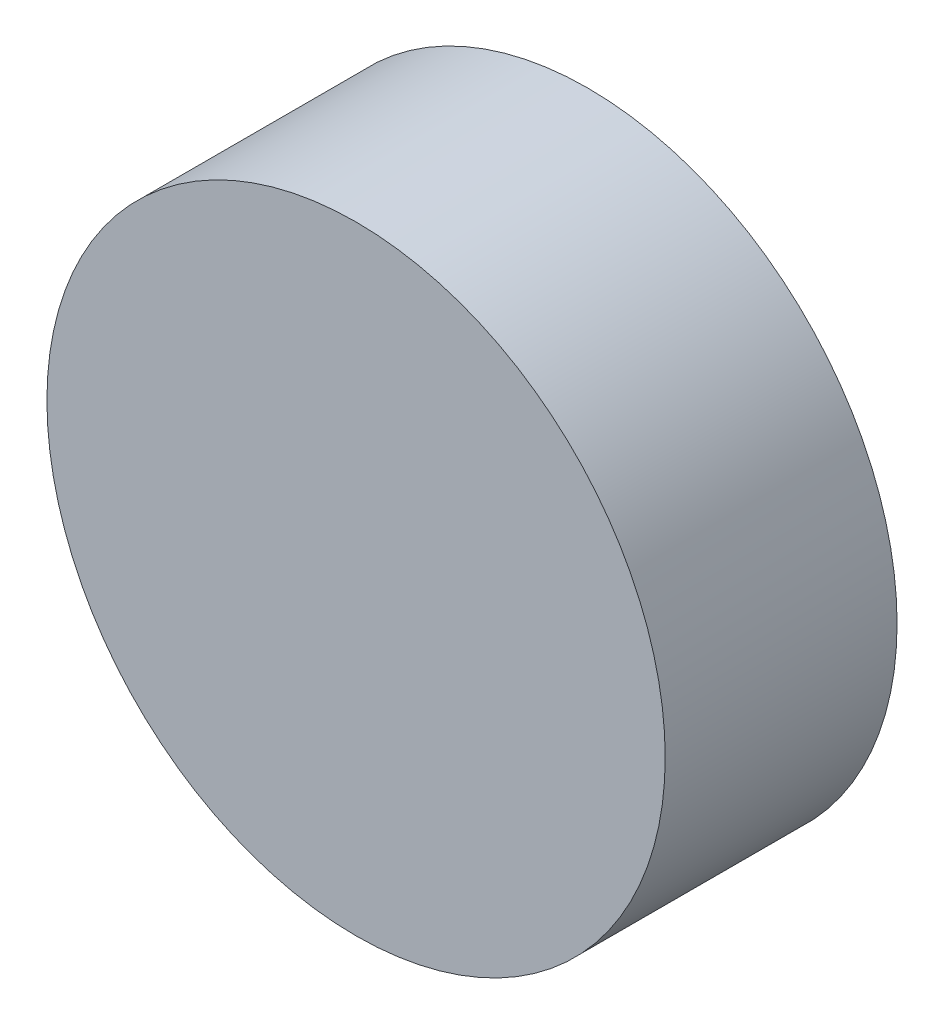
ISO-10303-21;
HEADER;
FILE_DESCRIPTION(('STEP AP214'),'2;1');
FILE_NAME('part.step','',(''),(''),'','','');
FILE_SCHEMA(('AUTOMOTIVE_DESIGN { 1 0 10303 214 1 1 1 1 }'));
ENDSEC;
DATA;
#1=APPLICATION_CONTEXT('core data for automotive mechanical design processes');
#2=APPLICATION_PROTOCOL_DEFINITION('international standard','automotive_design',2000,#1);
#3=PRODUCT_CONTEXT('',#1,'mechanical');
#4=PRODUCT('Part','Part','',(#3));
#5=PRODUCT_RELATED_PRODUCT_CATEGORY('part','',(#4));
#6=PRODUCT_DEFINITION_FORMATION('','',#4);
#7=PRODUCT_DEFINITION_CONTEXT('part definition',#1,'design');
#8=PRODUCT_DEFINITION('design','',#6,#7);
#9=PRODUCT_DEFINITION_SHAPE('','',#8);
#10=(LENGTH_UNIT() NAMED_UNIT(*) SI_UNIT(.MILLI.,.METRE.));
#11=(NAMED_UNIT(*) PLANE_ANGLE_UNIT() SI_UNIT($,.RADIAN.));
#12=(NAMED_UNIT(*) SI_UNIT($,.STERADIAN.) SOLID_ANGLE_UNIT());
#13=UNCERTAINTY_MEASURE_WITH_UNIT(LENGTH_MEASURE(1.E-05),#10,'distance_accuracy_value','');
#14=(GEOMETRIC_REPRESENTATION_CONTEXT(3) GLOBAL_UNCERTAINTY_ASSIGNED_CONTEXT((#13)) GLOBAL_UNIT_ASSIGNED_CONTEXT((#10,
#11,#12)) REPRESENTATION_CONTEXT('',''));
#15=CARTESIAN_POINT('',(0.,0.,0.));
#16=DIRECTION('',(0.,0.,1.));
#17=DIRECTION('',(1.,0.,0.));
#18=AXIS2_PLACEMENT_3D('',#15,#16,#17);
#19=CARTESIAN_POINT('',(0.,0.,0.));
#20=DIRECTION('',(0.,0.,1.));
#21=DIRECTION('',(1.,0.,0.));
#22=AXIS2_PLACEMENT_3D('',#19,#20,#21);
#23=PLANE('',#22);
#24=CARTESIAN_POINT('',(0.,0.,0.));
#25=DIRECTION('',(0.,0.,-1.));
#26=DIRECTION('',(-1.,0.,0.));
#27=AXIS2_PLACEMENT_3D('',#24,#25,#26);
#28=CIRCLE('',#27,5.08);
#29=CARTESIAN_POINT('',(-5.08,0.,0.));
#30=VERTEX_POINT('',#29);
#31=EDGE_CURVE('E66',#30,#30,#28,.T.);
#32=ORIENTED_EDGE('',*,*,#31,.F.);
#33=EDGE_LOOP('',(#32));
#34=FACE_BOUND('',#33,.T.);
#35=CARTESIAN_POINT('',(0.,0.,0.));
#36=DIRECTION('',(0.,0.,1.));
#37=DIRECTION('',(1.,0.,0.));
#38=AXIS2_PLACEMENT_3D('',#35,#36,#37);
#39=CIRCLE('',#38,101.6);
#40=CARTESIAN_POINT('',(-101.6,0.,0.));
#41=VERTEX_POINT('',#40);
#42=EDGE_CURVE('E11',#41,#41,#39,.T.);
#43=ORIENTED_EDGE('',*,*,#42,.F.);
#44=EDGE_LOOP('',(#43));
#45=FACE_BOUND('',#44,.T.);
#46=ADVANCED_FACE('F44',(#34,#45),#23,.F.);
#47=CARTESIAN_POINT('',(0.,0.,76.2));
#48=DIRECTION('',(0.,0.,1.));
#49=DIRECTION('',(1.,0.,0.));
#50=AXIS2_PLACEMENT_3D('',#47,#48,#49);
#51=PLANE('',#50);
#52=CARTESIAN_POINT('',(0.,0.,76.2));
#53=DIRECTION('',(0.,0.,1.));
#54=DIRECTION('',(1.,0.,0.));
#55=AXIS2_PLACEMENT_3D('',#52,#53,#54);
#56=CIRCLE('',#55,101.6);
#57=CARTESIAN_POINT('',(-101.6,0.,76.2));
#58=VERTEX_POINT('',#57);
#59=EDGE_CURVE('E60',#58,#58,#56,.T.);
#60=ORIENTED_EDGE('',*,*,#59,.T.);
#61=EDGE_LOOP('',(#60));
#62=FACE_BOUND('',#61,.T.);
#63=ADVANCED_FACE('F63',(#62),#51,.T.);
#64=CARTESIAN_POINT('',(0.,0.,0.));
#65=DIRECTION('',(0.,0.,1.));
#66=DIRECTION('',(1.,0.,0.));
#67=AXIS2_PLACEMENT_3D('',#64,#65,#66);
#68=CYLINDRICAL_SURFACE('',#67,101.6);
#69=ORIENTED_EDGE('',*,*,#59,.F.);
#70=DIRECTION('',(0.,0.,-1.));
#71=VECTOR('',#70,1.);
#72=CARTESIAN_POINT('',(-101.6,0.,0.));
#73=LINE('',#72,#71);
#74=EDGE_CURVE('E52',#58,#41,#73,.T.);
#75=ORIENTED_EDGE('',*,*,#74,.T.);
#76=ORIENTED_EDGE('',*,*,#42,.T.);
#77=ORIENTED_EDGE('',*,*,#74,.F.);
#78=EDGE_LOOP('',(#69,#75,#76,#77));
#79=FACE_BOUND('',#78,.T.);
#80=ADVANCED_FACE('F59',(#79),#68,.T.);
#81=CARTESIAN_POINT('',(0.,0.,5.08));
#82=DIRECTION('',(0.,0.,-1.));
#83=DIRECTION('',(-1.,0.,0.));
#84=AXIS2_PLACEMENT_3D('',#81,#82,#83);
#85=CYLINDRICAL_SURFACE('',#84,5.08);
#86=CARTESIAN_POINT('',(0.,0.,5.08));
#87=DIRECTION('',(0.,0.,-1.));
#88=DIRECTION('',(-1.,0.,0.));
#89=AXIS2_PLACEMENT_3D('',#86,#87,#88);
#90=CIRCLE('',#89,5.08);
#91=CARTESIAN_POINT('',(-5.08,0.,5.08));
#92=VERTEX_POINT('',#91);
#93=EDGE_CURVE('E64',#92,#92,#90,.T.);
#94=ORIENTED_EDGE('',*,*,#93,.F.);
#95=EDGE_LOOP('',(#94));
#96=FACE_BOUND('',#95,.T.);
#97=ORIENTED_EDGE('',*,*,#31,.T.);
#98=EDGE_LOOP('',(#97));
#99=FACE_BOUND('',#98,.T.);
#100=ADVANCED_FACE('F72',(#96,#99),#85,.F.);
#101=CARTESIAN_POINT('',(0.,0.,5.08));
#102=DIRECTION('',(0.,0.,-1.));
#103=DIRECTION('',(-1.,0.,0.));
#104=AXIS2_PLACEMENT_3D('',#101,#102,#103);
#105=PLANE('',#104);
#106=ORIENTED_EDGE('',*,*,#93,.T.);
#107=EDGE_LOOP('',(#106));
#108=FACE_BOUND('',#107,.T.);
#109=ADVANCED_FACE('F86',(#108),#105,.T.);
#110=CLOSED_SHELL('',(#46,#63,#80,#100,#109));
#111=MANIFOLD_SOLID_BREP('B2',#110);
#112=ADVANCED_BREP_SHAPE_REPRESENTATION('',(#18,#111),#14);
#113=SHAPE_DEFINITION_REPRESENTATION(#9,#112);
ENDSEC;
END-ISO-10303-21;
